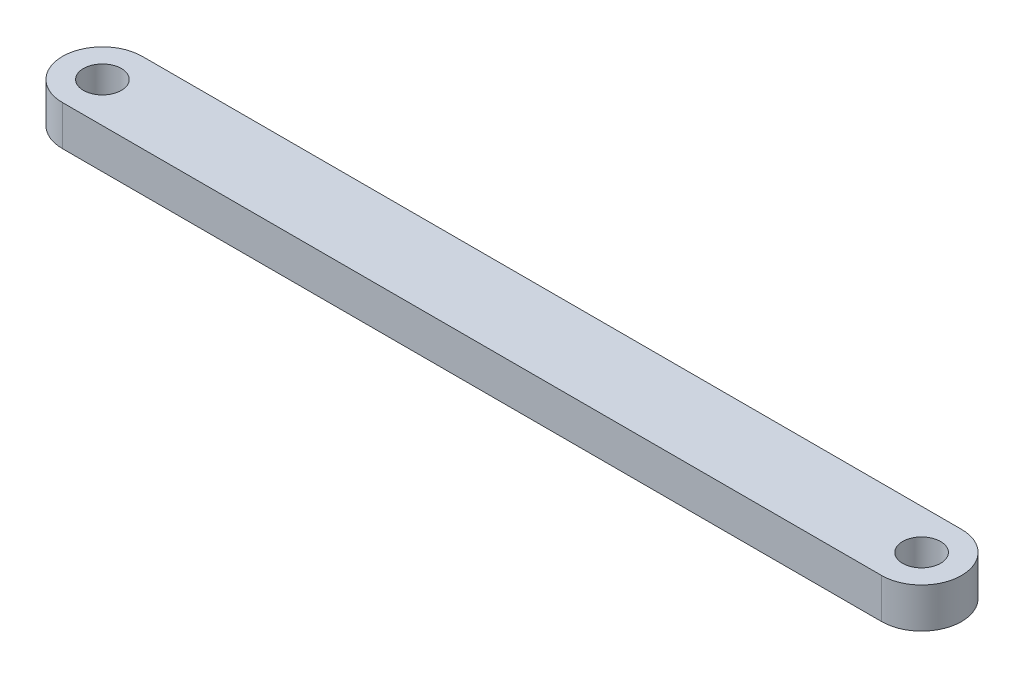
ISO-10303-21;
HEADER;
FILE_DESCRIPTION(('STEP AP214'),'2;1');
FILE_NAME('part.step','',(''),(''),'','','');
FILE_SCHEMA(('AUTOMOTIVE_DESIGN { 1 0 10303 214 1 1 1 1 }'));
ENDSEC;
DATA;
#1=APPLICATION_CONTEXT('core data for automotive mechanical design processes');
#2=APPLICATION_PROTOCOL_DEFINITION('international standard','automotive_design',2000,#1);
#3=PRODUCT_CONTEXT('',#1,'mechanical');
#4=PRODUCT('Part','Part','',(#3));
#5=PRODUCT_RELATED_PRODUCT_CATEGORY('part','',(#4));
#6=PRODUCT_DEFINITION_FORMATION('','',#4);
#7=PRODUCT_DEFINITION_CONTEXT('part definition',#1,'design');
#8=PRODUCT_DEFINITION('design','',#6,#7);
#9=PRODUCT_DEFINITION_SHAPE('','',#8);
#10=(LENGTH_UNIT() NAMED_UNIT(*) SI_UNIT(.MILLI.,.METRE.));
#11=(NAMED_UNIT(*) PLANE_ANGLE_UNIT() SI_UNIT($,.RADIAN.));
#12=(NAMED_UNIT(*) SI_UNIT($,.STERADIAN.) SOLID_ANGLE_UNIT());
#13=UNCERTAINTY_MEASURE_WITH_UNIT(LENGTH_MEASURE(1.E-05),#10,'distance_accuracy_value','');
#14=(GEOMETRIC_REPRESENTATION_CONTEXT(3) GLOBAL_UNCERTAINTY_ASSIGNED_CONTEXT((#13)) GLOBAL_UNIT_ASSIGNED_CONTEXT((#10,
#11,#12)) REPRESENTATION_CONTEXT('',''));
#15=CARTESIAN_POINT('',(0.,0.,0.));
#16=DIRECTION('',(0.,0.,1.));
#17=DIRECTION('',(1.,0.,0.));
#18=AXIS2_PLACEMENT_3D('',#15,#16,#17);
#19=CARTESIAN_POINT('',(0.,2.,0.));
#20=DIRECTION('',(0.,1.,0.));
#21=DIRECTION('',(0.,0.,1.));
#22=AXIS2_PLACEMENT_3D('',#19,#20,#21);
#23=PLANE('',#22);
#24=CARTESIAN_POINT('',(0.,2.,0.));
#25=DIRECTION('',(0.,1.,0.));
#26=DIRECTION('',(0.,0.,1.));
#27=AXIS2_PLACEMENT_3D('',#24,#25,#26);
#28=CIRCLE('',#27,0.95);
#29=CARTESIAN_POINT('',(0.,2.,0.95));
#30=VERTEX_POINT('',#29);
#31=EDGE_CURVE('E99',#30,#30,#28,.T.);
#32=ORIENTED_EDGE('',*,*,#31,.F.);
#33=EDGE_LOOP('',(#32));
#34=FACE_BOUND('',#33,.T.);
#35=CARTESIAN_POINT('',(0.,2.,0.));
#36=DIRECTION('',(0.,1.,0.));
#37=DIRECTION('',(0.,0.,1.));
#38=AXIS2_PLACEMENT_3D('',#35,#36,#37);
#39=CIRCLE('',#38,2.);
#40=CARTESIAN_POINT('',(0.,2.,-2.));
#41=VERTEX_POINT('',#40);
#42=CARTESIAN_POINT('',(0.,2.,2.));
#43=VERTEX_POINT('',#42);
#44=EDGE_CURVE('E84',#41,#43,#39,.T.);
#45=ORIENTED_EDGE('',*,*,#44,.T.);
#46=DIRECTION('',(1.,0.,0.));
#47=VECTOR('',#46,1.);
#48=CARTESIAN_POINT('',(0.,2.,2.));
#49=LINE('',#48,#47);
#50=CARTESIAN_POINT('',(41.,2.,2.));
#51=VERTEX_POINT('',#50);
#52=EDGE_CURVE('E79',#43,#51,#49,.T.);
#53=ORIENTED_EDGE('',*,*,#52,.T.);
#54=CARTESIAN_POINT('',(41.,2.,0.));
#55=DIRECTION('',(0.,1.,0.));
#56=DIRECTION('',(0.,0.,1.));
#57=AXIS2_PLACEMENT_3D('',#54,#55,#56);
#58=CIRCLE('',#57,2.);
#59=CARTESIAN_POINT('',(41.,2.,-2.));
#60=VERTEX_POINT('',#59);
#61=EDGE_CURVE('E82',#51,#60,#58,.T.);
#62=ORIENTED_EDGE('',*,*,#61,.T.);
#63=DIRECTION('',(-1.,0.,0.));
#64=VECTOR('',#63,1.);
#65=CARTESIAN_POINT('',(0.,2.,-2.));
#66=LINE('',#65,#64);
#67=EDGE_CURVE('E49',#60,#41,#66,.T.);
#68=ORIENTED_EDGE('',*,*,#67,.T.);
#69=EDGE_LOOP('',(#45,#53,#62,#68));
#70=FACE_BOUND('',#69,.T.);
#71=CARTESIAN_POINT('',(41.,2.,0.));
#72=DIRECTION('',(0.,1.,0.));
#73=DIRECTION('',(0.,0.,1.));
#74=AXIS2_PLACEMENT_3D('',#71,#72,#73);
#75=CIRCLE('',#74,0.950000000000001);
#76=CARTESIAN_POINT('',(41.,2.,0.950000000000001));
#77=VERTEX_POINT('',#76);
#78=EDGE_CURVE('E114',#77,#77,#75,.T.);
#79=ORIENTED_EDGE('',*,*,#78,.F.);
#80=EDGE_LOOP('',(#79));
#81=FACE_BOUND('',#80,.T.);
#82=ADVANCED_FACE('F32',(#34,#70,#81),#23,.T.);
#83=CARTESIAN_POINT('',(0.,0.,0.));
#84=DIRECTION('',(0.,1.,0.));
#85=DIRECTION('',(0.,0.,1.));
#86=AXIS2_PLACEMENT_3D('',#83,#84,#85);
#87=PLANE('',#86);
#88=CARTESIAN_POINT('',(0.,0.,0.));
#89=DIRECTION('',(0.,1.,0.));
#90=DIRECTION('',(0.,0.,1.));
#91=AXIS2_PLACEMENT_3D('',#88,#89,#90);
#92=CIRCLE('',#91,2.);
#93=CARTESIAN_POINT('',(0.,0.,-2.));
#94=VERTEX_POINT('',#93);
#95=CARTESIAN_POINT('',(0.,0.,2.));
#96=VERTEX_POINT('',#95);
#97=EDGE_CURVE('E96',#94,#96,#92,.T.);
#98=ORIENTED_EDGE('',*,*,#97,.F.);
#99=DIRECTION('',(-1.,0.,0.));
#100=VECTOR('',#99,1.);
#101=CARTESIAN_POINT('',(0.,0.,-2.));
#102=LINE('',#101,#100);
#103=CARTESIAN_POINT('',(41.,0.,-2.));
#104=VERTEX_POINT('',#103);
#105=EDGE_CURVE('E72',#104,#94,#102,.T.);
#106=ORIENTED_EDGE('',*,*,#105,.F.);
#107=CARTESIAN_POINT('',(41.,0.,0.));
#108=DIRECTION('',(0.,1.,0.));
#109=DIRECTION('',(0.,0.,1.));
#110=AXIS2_PLACEMENT_3D('',#107,#108,#109);
#111=CIRCLE('',#110,2.);
#112=CARTESIAN_POINT('',(41.,0.,2.));
#113=VERTEX_POINT('',#112);
#114=EDGE_CURVE('E66',#113,#104,#111,.T.);
#115=ORIENTED_EDGE('',*,*,#114,.F.);
#116=DIRECTION('',(1.,0.,0.));
#117=VECTOR('',#116,1.);
#118=CARTESIAN_POINT('',(0.,0.,2.));
#119=LINE('',#118,#117);
#120=EDGE_CURVE('E88',#96,#113,#119,.T.);
#121=ORIENTED_EDGE('',*,*,#120,.F.);
#122=EDGE_LOOP('',(#98,#106,#115,#121));
#123=FACE_BOUND('',#122,.T.);
#124=CARTESIAN_POINT('',(0.,0.,0.));
#125=DIRECTION('',(0.,1.,0.));
#126=DIRECTION('',(0.,0.,1.));
#127=AXIS2_PLACEMENT_3D('',#124,#125,#126);
#128=CIRCLE('',#127,0.95);
#129=CARTESIAN_POINT('',(0.,0.,0.95));
#130=VERTEX_POINT('',#129);
#131=EDGE_CURVE('E111',#130,#130,#128,.T.);
#132=ORIENTED_EDGE('',*,*,#131,.T.);
#133=EDGE_LOOP('',(#132));
#134=FACE_BOUND('',#133,.T.);
#135=CARTESIAN_POINT('',(41.,0.,0.));
#136=DIRECTION('',(0.,1.,0.));
#137=DIRECTION('',(0.,0.,1.));
#138=AXIS2_PLACEMENT_3D('',#135,#136,#137);
#139=CIRCLE('',#138,0.950000000000001);
#140=CARTESIAN_POINT('',(41.,0.,0.950000000000001));
#141=VERTEX_POINT('',#140);
#142=EDGE_CURVE('E117',#141,#141,#139,.T.);
#143=ORIENTED_EDGE('',*,*,#142,.T.);
#144=EDGE_LOOP('',(#143));
#145=FACE_BOUND('',#144,.T.);
#146=ADVANCED_FACE('F107',(#123,#134,#145),#87,.F.);
#147=CARTESIAN_POINT('',(0.,2.,0.));
#148=DIRECTION('',(0.,-1.,0.));
#149=DIRECTION('',(0.,0.,-1.));
#150=AXIS2_PLACEMENT_3D('',#147,#148,#149);
#151=CYLINDRICAL_SURFACE('',#150,2.);
#152=ORIENTED_EDGE('',*,*,#97,.T.);
#153=DIRECTION('',(0.,-1.,0.));
#154=VECTOR('',#153,1.);
#155=CARTESIAN_POINT('',(0.,2.,2.));
#156=LINE('',#155,#154);
#157=EDGE_CURVE('E11',#43,#96,#156,.T.);
#158=ORIENTED_EDGE('',*,*,#157,.F.);
#159=ORIENTED_EDGE('',*,*,#44,.F.);
#160=DIRECTION('',(0.,-1.,0.));
#161=VECTOR('',#160,1.);
#162=CARTESIAN_POINT('',(0.,2.,-2.));
#163=LINE('',#162,#161);
#164=EDGE_CURVE('E92',#41,#94,#163,.T.);
#165=ORIENTED_EDGE('',*,*,#164,.T.);
#166=EDGE_LOOP('',(#152,#158,#159,#165));
#167=FACE_BOUND('',#166,.T.);
#168=ADVANCED_FACE('F34',(#167),#151,.T.);
#169=CARTESIAN_POINT('',(0.,2.,2.));
#170=DIRECTION('',(0.,0.,-1.));
#171=DIRECTION('',(-1.,0.,0.));
#172=AXIS2_PLACEMENT_3D('',#169,#170,#171);
#173=PLANE('',#172);
#174=ORIENTED_EDGE('',*,*,#120,.T.);
#175=DIRECTION('',(0.,-1.,0.));
#176=VECTOR('',#175,1.);
#177=CARTESIAN_POINT('',(41.,2.,2.));
#178=LINE('',#177,#176);
#179=EDGE_CURVE('E41',#51,#113,#178,.T.);
#180=ORIENTED_EDGE('',*,*,#179,.F.);
#181=ORIENTED_EDGE('',*,*,#52,.F.);
#182=ORIENTED_EDGE('',*,*,#157,.T.);
#183=EDGE_LOOP('',(#174,#180,#181,#182));
#184=FACE_BOUND('',#183,.T.);
#185=ADVANCED_FACE('F87',(#184),#173,.F.);
#186=CARTESIAN_POINT('',(41.,2.,0.));
#187=DIRECTION('',(0.,-1.,0.));
#188=DIRECTION('',(0.,0.,-1.));
#189=AXIS2_PLACEMENT_3D('',#186,#187,#188);
#190=CYLINDRICAL_SURFACE('',#189,2.);
#191=ORIENTED_EDGE('',*,*,#114,.T.);
#192=DIRECTION('',(0.,-1.,0.));
#193=VECTOR('',#192,1.);
#194=CARTESIAN_POINT('',(41.,2.,-2.));
#195=LINE('',#194,#193);
#196=EDGE_CURVE('E89',#60,#104,#195,.T.);
#197=ORIENTED_EDGE('',*,*,#196,.F.);
#198=ORIENTED_EDGE('',*,*,#61,.F.);
#199=ORIENTED_EDGE('',*,*,#179,.T.);
#200=EDGE_LOOP('',(#191,#197,#198,#199));
#201=FACE_BOUND('',#200,.T.);
#202=ADVANCED_FACE('F90',(#201),#190,.T.);
#203=CARTESIAN_POINT('',(0.,2.,-2.));
#204=DIRECTION('',(0.,0.,1.));
#205=DIRECTION('',(1.,0.,0.));
#206=AXIS2_PLACEMENT_3D('',#203,#204,#205);
#207=PLANE('',#206);
#208=ORIENTED_EDGE('',*,*,#105,.T.);
#209=ORIENTED_EDGE('',*,*,#164,.F.);
#210=ORIENTED_EDGE('',*,*,#67,.F.);
#211=ORIENTED_EDGE('',*,*,#196,.T.);
#212=EDGE_LOOP('',(#208,#209,#210,#211));
#213=FACE_BOUND('',#212,.T.);
#214=ADVANCED_FACE('F104',(#213),#207,.F.);
#215=CARTESIAN_POINT('',(0.,2.,0.));
#216=DIRECTION('',(0.,-1.,0.));
#217=DIRECTION('',(0.,0.,-1.));
#218=AXIS2_PLACEMENT_3D('',#215,#216,#217);
#219=CYLINDRICAL_SURFACE('',#218,0.95);
#220=ORIENTED_EDGE('',*,*,#31,.T.);
#221=EDGE_LOOP('',(#220));
#222=FACE_BOUND('',#221,.T.);
#223=ORIENTED_EDGE('',*,*,#131,.F.);
#224=EDGE_LOOP('',(#223));
#225=FACE_BOUND('',#224,.T.);
#226=ADVANCED_FACE('F134',(#222,#225),#219,.F.);
#227=CARTESIAN_POINT('',(41.,2.,0.));
#228=DIRECTION('',(0.,-1.,0.));
#229=DIRECTION('',(0.,0.,-1.));
#230=AXIS2_PLACEMENT_3D('',#227,#228,#229);
#231=CYLINDRICAL_SURFACE('',#230,0.950000000000001);
#232=ORIENTED_EDGE('',*,*,#78,.T.);
#233=EDGE_LOOP('',(#232));
#234=FACE_BOUND('',#233,.T.);
#235=ORIENTED_EDGE('',*,*,#142,.F.);
#236=EDGE_LOOP('',(#235));
#237=FACE_BOUND('',#236,.T.);
#238=ADVANCED_FACE('F123',(#234,#237),#231,.F.);
#239=CLOSED_SHELL('',(#82,#146,#168,#185,#202,#214,#226,#238));
#240=MANIFOLD_SOLID_BREP('B2',#239);
#241=ADVANCED_BREP_SHAPE_REPRESENTATION('',(#18,#240),#14);
#242=SHAPE_DEFINITION_REPRESENTATION(#9,#241);
ENDSEC;
END-ISO-10303-21;
